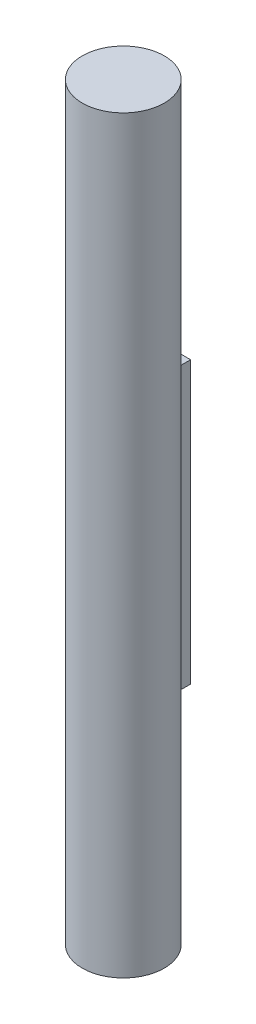
ISO-10303-21;
HEADER;
FILE_DESCRIPTION(('STEP AP214'),'2;1');
FILE_NAME('part.step','',(''),(''),'','','');
FILE_SCHEMA(('AUTOMOTIVE_DESIGN { 1 0 10303 214 1 1 1 1 }'));
ENDSEC;
DATA;
#1=APPLICATION_CONTEXT('core data for automotive mechanical design processes');
#2=APPLICATION_PROTOCOL_DEFINITION('international standard','automotive_design',2000,#1);
#3=PRODUCT_CONTEXT('',#1,'mechanical');
#4=PRODUCT('Part','Part','',(#3));
#5=PRODUCT_RELATED_PRODUCT_CATEGORY('part','',(#4));
#6=PRODUCT_DEFINITION_FORMATION('','',#4);
#7=PRODUCT_DEFINITION_CONTEXT('part definition',#1,'design');
#8=PRODUCT_DEFINITION('design','',#6,#7);
#9=PRODUCT_DEFINITION_SHAPE('','',#8);
#10=(LENGTH_UNIT() NAMED_UNIT(*) SI_UNIT(.MILLI.,.METRE.));
#11=(NAMED_UNIT(*) PLANE_ANGLE_UNIT() SI_UNIT($,.RADIAN.));
#12=(NAMED_UNIT(*) SI_UNIT($,.STERADIAN.) SOLID_ANGLE_UNIT());
#13=UNCERTAINTY_MEASURE_WITH_UNIT(LENGTH_MEASURE(1.E-05),#10,'distance_accuracy_value','');
#14=(GEOMETRIC_REPRESENTATION_CONTEXT(3) GLOBAL_UNCERTAINTY_ASSIGNED_CONTEXT((#13)) GLOBAL_UNIT_ASSIGNED_CONTEXT((#10,
#11,#12)) REPRESENTATION_CONTEXT('',''));
#15=CARTESIAN_POINT('',(0.,0.,0.));
#16=DIRECTION('',(0.,0.,1.));
#17=DIRECTION('',(1.,0.,0.));
#18=AXIS2_PLACEMENT_3D('',#15,#16,#17);
#19=CARTESIAN_POINT('',(0.,38.1,0.));
#20=DIRECTION('',(0.,-1.,0.));
#21=DIRECTION('',(0.,0.,-1.));
#22=AXIS2_PLACEMENT_3D('',#19,#20,#21);
#23=CYLINDRICAL_SURFACE('',#22,5.55625);
#24=CARTESIAN_POINT('',(0.,27.2142857142857,0.));
#25=DIRECTION('',(0.,1.,0.));
#26=DIRECTION('',(0.,0.,1.));
#27=AXIS2_PLACEMENT_3D('',#24,#25,#26);
#28=CIRCLE('',#27,5.55625);
#29=CARTESIAN_POINT('',(1.190625,27.2142857142857,-5.42718400018601));
#30=VERTEX_POINT('',#29);
#31=CARTESIAN_POINT('',(-1.190625,27.2142857142857,-5.42718400018601));
#32=VERTEX_POINT('',#31);
#33=EDGE_CURVE('E46',#30,#32,#28,.T.);
#34=ORIENTED_EDGE('',*,*,#33,.F.);
#35=DIRECTION('',(0.,-1.,0.));
#36=VECTOR('',#35,1.);
#37=CARTESIAN_POINT('',(1.190625,65.3142857142857,-5.42718400018601));
#38=LINE('',#37,#36);
#39=CARTESIAN_POINT('',(1.190625,65.3142857142857,-5.42718400018601));
#40=VERTEX_POINT('',#39);
#41=EDGE_CURVE('E13',#40,#30,#38,.T.);
#42=ORIENTED_EDGE('',*,*,#41,.F.);
#43=CARTESIAN_POINT('',(0.,65.3142857142857,0.));
#44=DIRECTION('',(0.,1.,0.));
#45=DIRECTION('',(0.,0.,1.));
#46=AXIS2_PLACEMENT_3D('',#43,#44,#45);
#47=CIRCLE('',#46,5.55625);
#48=CARTESIAN_POINT('',(-1.190625,65.3142857142857,-5.42718400018601));
#49=VERTEX_POINT('',#48);
#50=EDGE_CURVE('E102',#40,#49,#47,.T.);
#51=ORIENTED_EDGE('',*,*,#50,.T.);
#52=DIRECTION('',(0.,-1.,0.));
#53=VECTOR('',#52,1.);
#54=CARTESIAN_POINT('',(-1.190625,65.3142857142857,-5.42718400018601));
#55=LINE('',#54,#53);
#56=EDGE_CURVE('E74',#49,#32,#55,.T.);
#57=ORIENTED_EDGE('',*,*,#56,.T.);
#58=EDGE_LOOP('',(#34,#42,#51,#57));
#59=FACE_BOUND('',#58,.T.);
#60=ADVANCED_FACE('F42',(#59),#23,.F.);
#61=CARTESIAN_POINT('',(1.190625,65.3142857142857,0.));
#62=DIRECTION('',(1.,0.,0.));
#63=DIRECTION('',(0.,0.,-1.));
#64=AXIS2_PLACEMENT_3D('',#61,#62,#63);
#65=PLANE('',#64);
#66=DIRECTION('',(0.,0.,1.));
#67=VECTOR('',#66,1.);
#68=CARTESIAN_POINT('',(1.190625,27.2142857142857,0.));
#69=LINE('',#68,#67);
#70=CARTESIAN_POINT('',(1.190625,27.2142857142857,-7.9375));
#71=VERTEX_POINT('',#70);
#72=EDGE_CURVE('E94',#71,#30,#69,.T.);
#73=ORIENTED_EDGE('',*,*,#72,.F.);
#74=DIRECTION('',(0.,-1.,0.));
#75=VECTOR('',#74,1.);
#76=CARTESIAN_POINT('',(1.190625,65.3142857142857,-7.9375));
#77=LINE('',#76,#75);
#78=CARTESIAN_POINT('',(1.190625,65.3142857142857,-7.9375));
#79=VERTEX_POINT('',#78);
#80=EDGE_CURVE('E52',#79,#71,#77,.T.);
#81=ORIENTED_EDGE('',*,*,#80,.F.);
#82=DIRECTION('',(0.,0.,1.));
#83=VECTOR('',#82,1.);
#84=CARTESIAN_POINT('',(1.190625,65.3142857142857,0.));
#85=LINE('',#84,#83);
#86=EDGE_CURVE('E92',#79,#40,#85,.T.);
#87=ORIENTED_EDGE('',*,*,#86,.T.);
#88=ORIENTED_EDGE('',*,*,#41,.T.);
#89=EDGE_LOOP('',(#73,#81,#87,#88));
#90=FACE_BOUND('',#89,.T.);
#91=ADVANCED_FACE('F91',(#90),#65,.T.);
#92=CARTESIAN_POINT('',(0.,65.3142857142857,-7.9375));
#93=DIRECTION('',(0.,0.,-1.));
#94=DIRECTION('',(-1.,0.,0.));
#95=AXIS2_PLACEMENT_3D('',#92,#93,#94);
#96=PLANE('',#95);
#97=DIRECTION('',(1.,0.,0.));
#98=VECTOR('',#97,1.);
#99=CARTESIAN_POINT('',(0.,27.2142857142857,-7.9375));
#100=LINE('',#99,#98);
#101=CARTESIAN_POINT('',(-1.190625,27.2142857142857,-7.9375));
#102=VERTEX_POINT('',#101);
#103=EDGE_CURVE('E109',#102,#71,#100,.T.);
#104=ORIENTED_EDGE('',*,*,#103,.F.);
#105=DIRECTION('',(0.,-1.,0.));
#106=VECTOR('',#105,1.);
#107=CARTESIAN_POINT('',(-1.190625,65.3142857142857,-7.9375));
#108=LINE('',#107,#106);
#109=CARTESIAN_POINT('',(-1.190625,65.3142857142857,-7.9375));
#110=VERTEX_POINT('',#109);
#111=EDGE_CURVE('E81',#110,#102,#108,.T.);
#112=ORIENTED_EDGE('',*,*,#111,.F.);
#113=DIRECTION('',(1.,0.,0.));
#114=VECTOR('',#113,1.);
#115=CARTESIAN_POINT('',(0.,65.3142857142857,-7.9375));
#116=LINE('',#115,#114);
#117=EDGE_CURVE('E101',#110,#79,#116,.T.);
#118=ORIENTED_EDGE('',*,*,#117,.T.);
#119=ORIENTED_EDGE('',*,*,#80,.T.);
#120=EDGE_LOOP('',(#104,#112,#118,#119));
#121=FACE_BOUND('',#120,.T.);
#122=ADVANCED_FACE('F44',(#121),#96,.T.);
#123=CARTESIAN_POINT('',(-1.190625,65.3142857142857,0.));
#124=DIRECTION('',(1.,0.,0.));
#125=DIRECTION('',(0.,0.,-1.));
#126=AXIS2_PLACEMENT_3D('',#123,#124,#125);
#127=PLANE('',#126);
#128=DIRECTION('',(0.,0.,1.));
#129=VECTOR('',#128,1.);
#130=CARTESIAN_POINT('',(-1.190625,27.2142857142857,0.));
#131=LINE('',#130,#129);
#132=EDGE_CURVE('E108',#102,#32,#131,.T.);
#133=ORIENTED_EDGE('',*,*,#132,.T.);
#134=ORIENTED_EDGE('',*,*,#56,.F.);
#135=DIRECTION('',(0.,0.,1.));
#136=VECTOR('',#135,1.);
#137=CARTESIAN_POINT('',(-1.190625,65.3142857142857,0.));
#138=LINE('',#137,#136);
#139=EDGE_CURVE('E61',#110,#49,#138,.T.);
#140=ORIENTED_EDGE('',*,*,#139,.F.);
#141=ORIENTED_EDGE('',*,*,#111,.T.);
#142=EDGE_LOOP('',(#133,#134,#140,#141));
#143=FACE_BOUND('',#142,.T.);
#144=ADVANCED_FACE('F125',(#143),#127,.F.);
#145=CARTESIAN_POINT('',(0.,65.3142857142857,0.));
#146=DIRECTION('',(0.,1.,0.));
#147=DIRECTION('',(0.,0.,1.));
#148=AXIS2_PLACEMENT_3D('',#145,#146,#147);
#149=PLANE('',#148);
#150=ORIENTED_EDGE('',*,*,#50,.F.);
#151=ORIENTED_EDGE('',*,*,#86,.F.);
#152=ORIENTED_EDGE('',*,*,#117,.F.);
#153=ORIENTED_EDGE('',*,*,#139,.T.);
#154=EDGE_LOOP('',(#150,#151,#152,#153));
#155=FACE_BOUND('',#154,.T.);
#156=ADVANCED_FACE('F100',(#155),#149,.T.);
#157=CARTESIAN_POINT('',(0.,27.2142857142857,0.));
#158=DIRECTION('',(0.,1.,0.));
#159=DIRECTION('',(0.,0.,1.));
#160=AXIS2_PLACEMENT_3D('',#157,#158,#159);
#161=PLANE('',#160);
#162=ORIENTED_EDGE('',*,*,#33,.T.);
#163=ORIENTED_EDGE('',*,*,#132,.F.);
#164=ORIENTED_EDGE('',*,*,#103,.T.);
#165=ORIENTED_EDGE('',*,*,#72,.T.);
#166=EDGE_LOOP('',(#162,#163,#164,#165));
#167=FACE_BOUND('',#166,.T.);
#168=ADVANCED_FACE('F115',(#167),#161,.F.);
#169=CLOSED_SHELL('',(#60,#91,#122,#144,#156,#168));
#170=MANIFOLD_SOLID_BREP('B2',#169);
#171=CARTESIAN_POINT('',(0.,101.6,0.));
#172=DIRECTION('',(0.,-1.,0.));
#173=DIRECTION('',(0.,0.,-1.));
#174=AXIS2_PLACEMENT_3D('',#171,#172,#173);
#175=CYLINDRICAL_SURFACE('',#174,5.55625);
#176=CARTESIAN_POINT('',(0.,101.6,0.));
#177=DIRECTION('',(0.,1.,0.));
#178=DIRECTION('',(0.,0.,1.));
#179=AXIS2_PLACEMENT_3D('',#176,#177,#178);
#180=CIRCLE('',#179,5.55625);
#181=CARTESIAN_POINT('',(0.,101.6,5.55625));
#182=VERTEX_POINT('',#181);
#183=EDGE_CURVE('E41',#182,#182,#180,.T.);
#184=ORIENTED_EDGE('',*,*,#183,.F.);
#185=EDGE_LOOP('',(#184));
#186=FACE_BOUND('',#185,.T.);
#187=CARTESIAN_POINT('',(0.,0.,0.));
#188=DIRECTION('',(0.,1.,0.));
#189=DIRECTION('',(0.,0.,1.));
#190=AXIS2_PLACEMENT_3D('',#187,#188,#189);
#191=CIRCLE('',#190,5.55625);
#192=CARTESIAN_POINT('',(0.,0.,5.55625));
#193=VERTEX_POINT('',#192);
#194=EDGE_CURVE('E169',#193,#193,#191,.T.);
#195=ORIENTED_EDGE('',*,*,#194,.T.);
#196=EDGE_LOOP('',(#195));
#197=FACE_BOUND('',#196,.T.);
#198=ADVANCED_FACE('F166',(#186,#197),#175,.T.);
#199=CARTESIAN_POINT('',(0.,101.6,0.));
#200=DIRECTION('',(0.,1.,0.));
#201=DIRECTION('',(0.,0.,1.));
#202=AXIS2_PLACEMENT_3D('',#199,#200,#201);
#203=PLANE('',#202);
#204=ORIENTED_EDGE('',*,*,#183,.T.);
#205=EDGE_LOOP('',(#204));
#206=FACE_BOUND('',#205,.T.);
#207=ADVANCED_FACE('F181',(#206),#203,.T.);
#208=CARTESIAN_POINT('',(0.,0.,0.));
#209=DIRECTION('',(0.,1.,0.));
#210=DIRECTION('',(0.,0.,1.));
#211=AXIS2_PLACEMENT_3D('',#208,#209,#210);
#212=PLANE('',#211);
#213=ORIENTED_EDGE('',*,*,#194,.F.);
#214=EDGE_LOOP('',(#213));
#215=FACE_BOUND('',#214,.T.);
#216=ADVANCED_FACE('F179',(#215),#212,.F.);
#217=CLOSED_SHELL('',(#198,#207,#216));
#218=MANIFOLD_SOLID_BREP('B7',#217);
#219=ADVANCED_BREP_SHAPE_REPRESENTATION('',(#18,#170,#218),#14);
#220=SHAPE_DEFINITION_REPRESENTATION(#9,#219);
ENDSEC;
END-ISO-10303-21;
